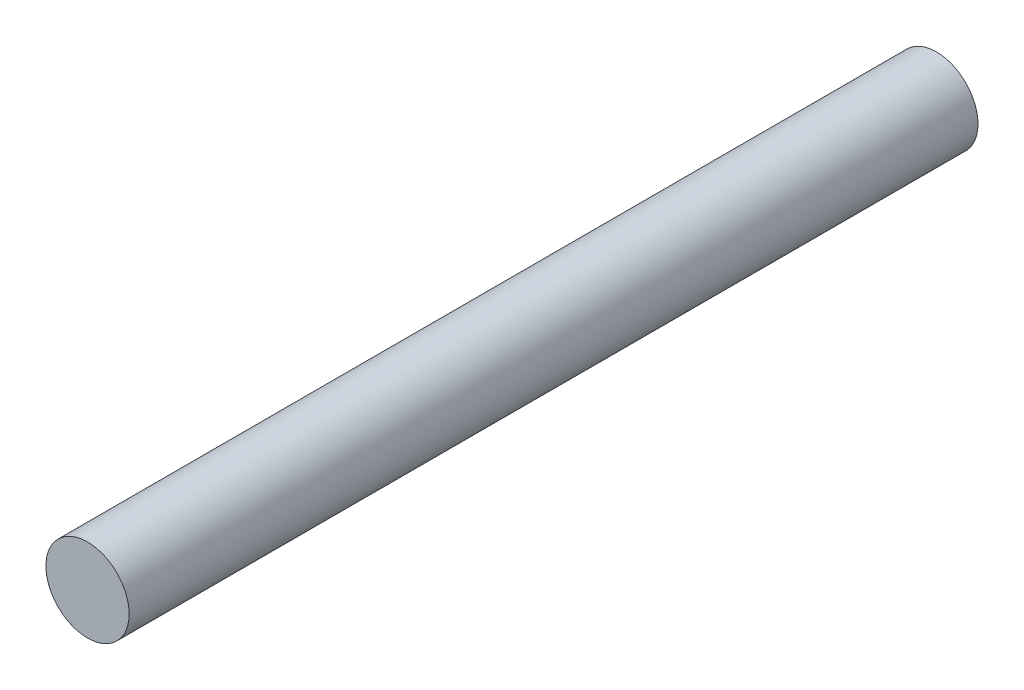
ISO-10303-21;
HEADER;
FILE_DESCRIPTION(('STEP AP214'),'2;1');
FILE_NAME('part.step','',(''),(''),'','','');
FILE_SCHEMA(('AUTOMOTIVE_DESIGN { 1 0 10303 214 1 1 1 1 }'));
ENDSEC;
DATA;
#1=APPLICATION_CONTEXT('core data for automotive mechanical design processes');
#2=APPLICATION_PROTOCOL_DEFINITION('international standard','automotive_design',2000,#1);
#3=PRODUCT_CONTEXT('',#1,'mechanical');
#4=PRODUCT('Part','Part','',(#3));
#5=PRODUCT_RELATED_PRODUCT_CATEGORY('part','',(#4));
#6=PRODUCT_DEFINITION_FORMATION('','',#4);
#7=PRODUCT_DEFINITION_CONTEXT('part definition',#1,'design');
#8=PRODUCT_DEFINITION('design','',#6,#7);
#9=PRODUCT_DEFINITION_SHAPE('','',#8);
#10=(LENGTH_UNIT() NAMED_UNIT(*) SI_UNIT(.MILLI.,.METRE.));
#11=(NAMED_UNIT(*) PLANE_ANGLE_UNIT() SI_UNIT($,.RADIAN.));
#12=(NAMED_UNIT(*) SI_UNIT($,.STERADIAN.) SOLID_ANGLE_UNIT());
#13=UNCERTAINTY_MEASURE_WITH_UNIT(LENGTH_MEASURE(1.E-05),#10,'distance_accuracy_value','');
#14=(GEOMETRIC_REPRESENTATION_CONTEXT(3) GLOBAL_UNCERTAINTY_ASSIGNED_CONTEXT((#13)) GLOBAL_UNIT_ASSIGNED_CONTEXT((#10,
#11,#12)) REPRESENTATION_CONTEXT('',''));
#15=CARTESIAN_POINT('',(0.,0.,0.));
#16=DIRECTION('',(0.,0.,1.));
#17=DIRECTION('',(1.,0.,0.));
#18=AXIS2_PLACEMENT_3D('',#15,#16,#17);
#19=CARTESIAN_POINT('',(0.,0.,25.5));
#20=DIRECTION('',(0.,0.,-1.));
#21=DIRECTION('',(-1.,0.,0.));
#22=AXIS2_PLACEMENT_3D('',#19,#20,#21);
#23=PLANE('',#22);
#24=CARTESIAN_POINT('',(0.,0.,25.5));
#25=DIRECTION('',(0.,0.,1.));
#26=DIRECTION('',(1.,0.,0.));
#27=AXIS2_PLACEMENT_3D('',#24,#25,#26);
#28=CIRCLE('',#27,2.5);
#29=CARTESIAN_POINT('',(2.5,0.,25.5));
#30=VERTEX_POINT('',#29);
#31=EDGE_CURVE('E10',#30,#30,#28,.T.);
#32=ORIENTED_EDGE('',*,*,#31,.T.);
#33=EDGE_LOOP('',(#32));
#34=FACE_BOUND('',#33,.T.);
#35=ADVANCED_FACE('F34',(#34),#23,.F.);
#36=CARTESIAN_POINT('',(0.,0.,25.5));
#37=DIRECTION('',(0.,0.,1.));
#38=DIRECTION('',(1.,0.,0.));
#39=AXIS2_PLACEMENT_3D('',#36,#37,#38);
#40=CYLINDRICAL_SURFACE('',#39,2.5);
#41=ORIENTED_EDGE('',*,*,#31,.F.);
#42=EDGE_LOOP('',(#41));
#43=FACE_BOUND('',#42,.T.);
#44=CARTESIAN_POINT('',(0.,0.,-25.5));
#45=DIRECTION('',(0.,0.,1.));
#46=DIRECTION('',(1.,0.,0.));
#47=AXIS2_PLACEMENT_3D('',#44,#45,#46);
#48=CIRCLE('',#47,2.5);
#49=CARTESIAN_POINT('',(2.5,0.,-25.5));
#50=VERTEX_POINT('',#49);
#51=EDGE_CURVE('E40',#50,#50,#48,.T.);
#52=ORIENTED_EDGE('',*,*,#51,.T.);
#53=EDGE_LOOP('',(#52));
#54=FACE_BOUND('',#53,.T.);
#55=ADVANCED_FACE('F46',(#43,#54),#40,.T.);
#56=CARTESIAN_POINT('',(0.,0.,-25.5));
#57=DIRECTION('',(0.,0.,1.));
#58=DIRECTION('',(1.,0.,0.));
#59=AXIS2_PLACEMENT_3D('',#56,#57,#58);
#60=PLANE('',#59);
#61=ORIENTED_EDGE('',*,*,#51,.F.);
#62=EDGE_LOOP('',(#61));
#63=FACE_BOUND('',#62,.T.);
#64=ADVANCED_FACE('F48',(#63),#60,.F.);
#65=CLOSED_SHELL('',(#35,#55,#64));
#66=MANIFOLD_SOLID_BREP('B2',#65);
#67=ADVANCED_BREP_SHAPE_REPRESENTATION('',(#18,#66),#14);
#68=SHAPE_DEFINITION_REPRESENTATION(#9,#67);
ENDSEC;
END-ISO-10303-21;
